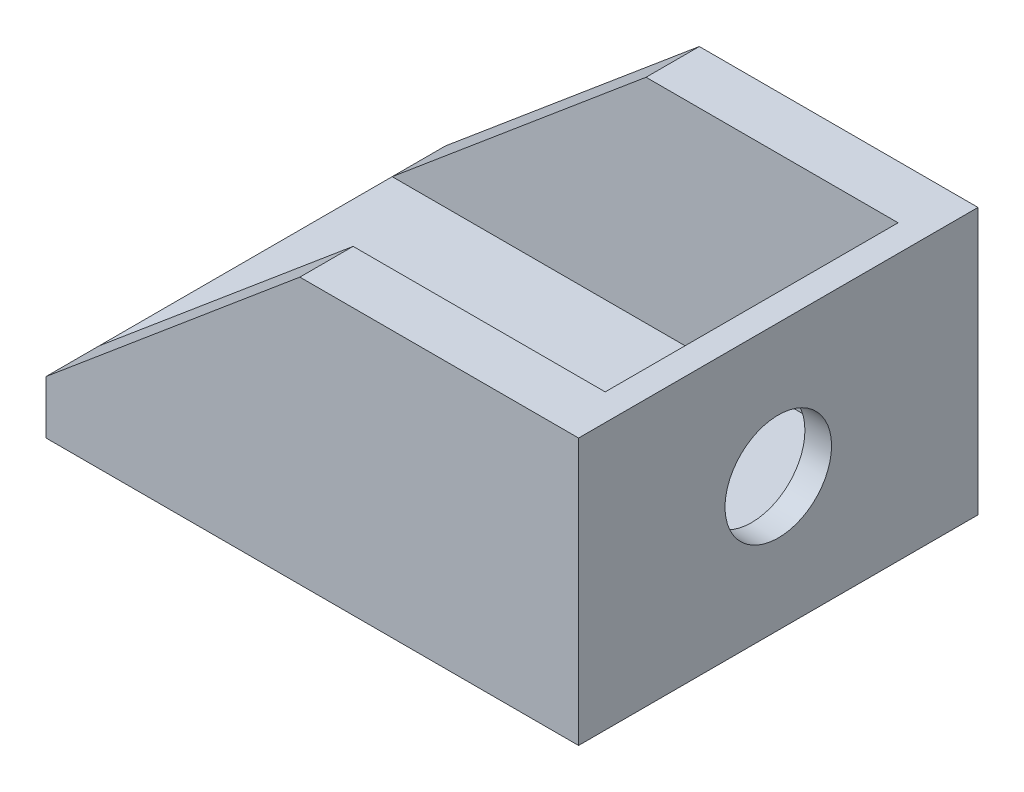
ISO-10303-21;
HEADER;
FILE_DESCRIPTION(('STEP AP214'),'2;1');
FILE_NAME('part.step','',(''),(''),'','','');
FILE_SCHEMA(('AUTOMOTIVE_DESIGN { 1 0 10303 214 1 1 1 1 }'));
ENDSEC;
DATA;
#1=APPLICATION_CONTEXT('core data for automotive mechanical design processes');
#2=APPLICATION_PROTOCOL_DEFINITION('international standard','automotive_design',2000,#1);
#3=PRODUCT_CONTEXT('',#1,'mechanical');
#4=PRODUCT('Part','Part','',(#3));
#5=PRODUCT_RELATED_PRODUCT_CATEGORY('part','',(#4));
#6=PRODUCT_DEFINITION_FORMATION('','',#4);
#7=PRODUCT_DEFINITION_CONTEXT('part definition',#1,'design');
#8=PRODUCT_DEFINITION('design','',#6,#7);
#9=PRODUCT_DEFINITION_SHAPE('','',#8);
#10=(LENGTH_UNIT() NAMED_UNIT(*) SI_UNIT(.MILLI.,.METRE.));
#11=(NAMED_UNIT(*) PLANE_ANGLE_UNIT() SI_UNIT($,.RADIAN.));
#12=(NAMED_UNIT(*) SI_UNIT($,.STERADIAN.) SOLID_ANGLE_UNIT());
#13=UNCERTAINTY_MEASURE_WITH_UNIT(LENGTH_MEASURE(1.E-05),#10,'distance_accuracy_value','');
#14=(GEOMETRIC_REPRESENTATION_CONTEXT(3) GLOBAL_UNCERTAINTY_ASSIGNED_CONTEXT((#13)) GLOBAL_UNIT_ASSIGNED_CONTEXT((#10,
#11,#12)) REPRESENTATION_CONTEXT('',''));
#15=CARTESIAN_POINT('',(0.,0.,0.));
#16=DIRECTION('',(0.,0.,1.));
#17=DIRECTION('',(1.,0.,0.));
#18=AXIS2_PLACEMENT_3D('',#15,#16,#17);
#19=CARTESIAN_POINT('',(0.,2.,0.));
#20=DIRECTION('',(1.,0.,0.));
#21=DIRECTION('',(0.,0.,-1.));
#22=AXIS2_PLACEMENT_3D('',#19,#20,#21);
#23=PLANE('',#22);
#24=DIRECTION('',(0.,0.,1.));
#25=VECTOR('',#24,1.);
#26=CARTESIAN_POINT('',(0.,2.,0.));
#27=LINE('',#26,#25);
#28=CARTESIAN_POINT('',(0.,2.,-11.));
#29=VERTEX_POINT('',#28);
#30=CARTESIAN_POINT('',(0.,2.,0.));
#31=VERTEX_POINT('',#30);
#32=EDGE_CURVE('E166',#29,#31,#27,.T.);
#33=ORIENTED_EDGE('',*,*,#32,.F.);
#34=CARTESIAN_POINT('',(0.,2.,-13.));
#35=VERTEX_POINT('',#34);
#36=EDGE_CURVE('E162',#35,#29,#27,.T.);
#37=ORIENTED_EDGE('',*,*,#36,.F.);
#38=DIRECTION('',(0.,-1.,0.));
#39=VECTOR('',#38,1.);
#40=CARTESIAN_POINT('',(0.,2.,-13.));
#41=LINE('',#40,#39);
#42=CARTESIAN_POINT('',(0.,0.,-13.));
#43=VERTEX_POINT('',#42);
#44=EDGE_CURVE('E43',#35,#43,#41,.T.);
#45=ORIENTED_EDGE('',*,*,#44,.T.);
#46=DIRECTION('',(0.,0.,1.));
#47=VECTOR('',#46,1.);
#48=CARTESIAN_POINT('',(0.,0.,0.));
#49=LINE('',#48,#47);
#50=CARTESIAN_POINT('',(0.,0.,2.));
#51=VERTEX_POINT('',#50);
#52=EDGE_CURVE('E161',#43,#51,#49,.T.);
#53=ORIENTED_EDGE('',*,*,#52,.T.);
#54=DIRECTION('',(0.,-1.,0.));
#55=VECTOR('',#54,1.);
#56=CARTESIAN_POINT('',(0.,0.,2.));
#57=LINE('',#56,#55);
#58=CARTESIAN_POINT('',(0.,2.,2.));
#59=VERTEX_POINT('',#58);
#60=EDGE_CURVE('E137',#59,#51,#57,.T.);
#61=ORIENTED_EDGE('',*,*,#60,.F.);
#62=DIRECTION('',(0.,0.,-1.));
#63=VECTOR('',#62,1.);
#64=CARTESIAN_POINT('',(0.,2.,2.));
#65=LINE('',#64,#63);
#66=EDGE_CURVE('E150',#59,#31,#65,.T.);
#67=ORIENTED_EDGE('',*,*,#66,.T.);
#68=EDGE_LOOP('',(#33,#37,#45,#53,#61,#67));
#69=FACE_BOUND('',#68,.T.);
#70=ADVANCED_FACE('F35',(#69),#23,.F.);
#71=CARTESIAN_POINT('',(20.,2.,0.));
#72=DIRECTION('',(-1.,0.,0.));
#73=DIRECTION('',(0.,0.,1.));
#74=AXIS2_PLACEMENT_3D('',#71,#72,#73);
#75=PLANE('',#74);
#76=CARTESIAN_POINT('',(20.,5.,-5.5));
#77=DIRECTION('',(1.,0.,0.));
#78=DIRECTION('',(0.,0.,-1.));
#79=AXIS2_PLACEMENT_3D('',#76,#77,#78);
#80=CIRCLE('',#79,2.);
#81=CARTESIAN_POINT('',(20.,5.,-7.5));
#82=VERTEX_POINT('',#81);
#83=EDGE_CURVE('E199',#82,#82,#80,.T.);
#84=ORIENTED_EDGE('',*,*,#83,.F.);
#85=EDGE_LOOP('',(#84));
#86=FACE_BOUND('',#85,.T.);
#87=DIRECTION('',(0.,-1.,0.));
#88=VECTOR('',#87,1.);
#89=CARTESIAN_POINT('',(20.,2.,-13.));
#90=LINE('',#89,#88);
#91=CARTESIAN_POINT('',(20.,10.,-13.));
#92=VERTEX_POINT('',#91);
#93=CARTESIAN_POINT('',(20.,0.,-13.));
#94=VERTEX_POINT('',#93);
#95=EDGE_CURVE('E11',#92,#94,#90,.T.);
#96=ORIENTED_EDGE('',*,*,#95,.F.);
#97=DIRECTION('',(0.,0.,-1.));
#98=VECTOR('',#97,1.);
#99=CARTESIAN_POINT('',(20.,10.,2.));
#100=LINE('',#99,#98);
#101=CARTESIAN_POINT('',(20.,10.,2.));
#102=VERTEX_POINT('',#101);
#103=EDGE_CURVE('E159',#102,#92,#100,.T.);
#104=ORIENTED_EDGE('',*,*,#103,.F.);
#105=DIRECTION('',(0.,1.,0.));
#106=VECTOR('',#105,1.);
#107=CARTESIAN_POINT('',(20.,0.,2.));
#108=LINE('',#107,#106);
#109=CARTESIAN_POINT('',(20.,0.,2.));
#110=VERTEX_POINT('',#109);
#111=EDGE_CURVE('E144',#110,#102,#108,.T.);
#112=ORIENTED_EDGE('',*,*,#111,.F.);
#113=DIRECTION('',(0.,0.,-1.));
#114=VECTOR('',#113,1.);
#115=CARTESIAN_POINT('',(20.,0.,0.));
#116=LINE('',#115,#114);
#117=EDGE_CURVE('E169',#110,#94,#116,.T.);
#118=ORIENTED_EDGE('',*,*,#117,.T.);
#119=EDGE_LOOP('',(#96,#104,#112,#118));
#120=FACE_BOUND('',#119,.T.);
#121=ADVANCED_FACE('F220',(#86,#120),#75,.F.);
#122=CARTESIAN_POINT('',(0.,2.,-13.));
#123=DIRECTION('',(0.,0.,1.));
#124=DIRECTION('',(1.,0.,0.));
#125=AXIS2_PLACEMENT_3D('',#122,#123,#124);
#126=PLANE('',#125);
#127=DIRECTION('',(-1.,0.,0.));
#128=VECTOR('',#127,1.);
#129=CARTESIAN_POINT('',(0.,0.,-13.));
#130=LINE('',#129,#128);
#131=EDGE_CURVE('E171',#94,#43,#130,.T.);
#132=ORIENTED_EDGE('',*,*,#131,.T.);
#133=ORIENTED_EDGE('',*,*,#44,.F.);
#134=DIRECTION('',(-0.766044443118977,-0.64278760968654,0.));
#135=VECTOR('',#134,1.);
#136=CARTESIAN_POINT('',(0.,2.,-13.));
#137=LINE('',#136,#135);
#138=CARTESIAN_POINT('',(9.53402874075366,10.,-13.));
#139=VERTEX_POINT('',#138);
#140=EDGE_CURVE('E115',#139,#35,#137,.T.);
#141=ORIENTED_EDGE('',*,*,#140,.F.);
#142=DIRECTION('',(-1.,0.,0.));
#143=VECTOR('',#142,1.);
#144=CARTESIAN_POINT('',(9.53402874075366,10.,-13.));
#145=LINE('',#144,#143);
#146=EDGE_CURVE('E133',#92,#139,#145,.T.);
#147=ORIENTED_EDGE('',*,*,#146,.F.);
#148=ORIENTED_EDGE('',*,*,#95,.T.);
#149=EDGE_LOOP('',(#132,#133,#141,#147,#148));
#150=FACE_BOUND('',#149,.T.);
#151=ADVANCED_FACE('F224',(#150),#126,.F.);
#152=CARTESIAN_POINT('',(0.,2.,0.));
#153=DIRECTION('',(0.,-1.,0.));
#154=DIRECTION('',(0.,0.,-1.));
#155=AXIS2_PLACEMENT_3D('',#152,#153,#154);
#156=PLANE('',#155);
#157=DIRECTION('',(1.,0.,0.));
#158=VECTOR('',#157,1.);
#159=CARTESIAN_POINT('',(0.,2.,0.));
#160=LINE('',#159,#158);
#161=CARTESIAN_POINT('',(19.,2.,0.));
#162=VERTEX_POINT('',#161);
#163=EDGE_CURVE('E165',#31,#162,#160,.T.);
#164=ORIENTED_EDGE('',*,*,#163,.T.);
#165=DIRECTION('',(0.,0.,-1.));
#166=VECTOR('',#165,1.);
#167=CARTESIAN_POINT('',(19.,2.,0.));
#168=LINE('',#167,#166);
#169=CARTESIAN_POINT('',(19.,2.,-11.));
#170=VERTEX_POINT('',#169);
#171=EDGE_CURVE('E125',#162,#170,#168,.T.);
#172=ORIENTED_EDGE('',*,*,#171,.T.);
#173=DIRECTION('',(-1.,0.,0.));
#174=VECTOR('',#173,1.);
#175=CARTESIAN_POINT('',(0.,2.,-11.));
#176=LINE('',#175,#174);
#177=EDGE_CURVE('E122',#170,#29,#176,.T.);
#178=ORIENTED_EDGE('',*,*,#177,.T.);
#179=ORIENTED_EDGE('',*,*,#32,.T.);
#180=EDGE_LOOP('',(#164,#172,#178,#179));
#181=FACE_BOUND('',#180,.T.);
#182=ADVANCED_FACE('F196',(#181),#156,.F.);
#183=CARTESIAN_POINT('',(0.,0.,0.));
#184=DIRECTION('',(0.,-1.,0.));
#185=DIRECTION('',(0.,0.,-1.));
#186=AXIS2_PLACEMENT_3D('',#183,#184,#185);
#187=PLANE('',#186);
#188=DIRECTION('',(1.,0.,0.));
#189=VECTOR('',#188,1.);
#190=CARTESIAN_POINT('',(0.,0.,2.));
#191=LINE('',#190,#189);
#192=EDGE_CURVE('E140',#51,#110,#191,.T.);
#193=ORIENTED_EDGE('',*,*,#192,.F.);
#194=ORIENTED_EDGE('',*,*,#52,.F.);
#195=ORIENTED_EDGE('',*,*,#131,.F.);
#196=ORIENTED_EDGE('',*,*,#117,.F.);
#197=EDGE_LOOP('',(#193,#194,#195,#196));
#198=FACE_BOUND('',#197,.T.);
#199=ADVANCED_FACE('F185',(#198),#187,.T.);
#200=CARTESIAN_POINT('',(0.,0.,0.));
#201=DIRECTION('',(0.,0.,-1.));
#202=DIRECTION('',(-1.,0.,0.));
#203=AXIS2_PLACEMENT_3D('',#200,#201,#202);
#204=PLANE('',#203);
#205=DIRECTION('',(0.,-1.,0.));
#206=VECTOR('',#205,1.);
#207=CARTESIAN_POINT('',(19.,2.,0.));
#208=LINE('',#207,#206);
#209=CARTESIAN_POINT('',(19.,10.,0.));
#210=VERTEX_POINT('',#209);
#211=EDGE_CURVE('E50',#210,#162,#208,.T.);
#212=ORIENTED_EDGE('',*,*,#211,.T.);
#213=ORIENTED_EDGE('',*,*,#163,.F.);
#214=DIRECTION('',(-0.766044443118977,-0.64278760968654,0.));
#215=VECTOR('',#214,1.);
#216=CARTESIAN_POINT('',(0.,2.,0.));
#217=LINE('',#216,#215);
#218=CARTESIAN_POINT('',(9.53402874075366,10.,0.));
#219=VERTEX_POINT('',#218);
#220=EDGE_CURVE('E141',#219,#31,#217,.T.);
#221=ORIENTED_EDGE('',*,*,#220,.F.);
#222=DIRECTION('',(-1.,0.,0.));
#223=VECTOR('',#222,1.);
#224=CARTESIAN_POINT('',(9.53402874075366,10.,0.));
#225=LINE('',#224,#223);
#226=EDGE_CURVE('E55',#210,#219,#225,.T.);
#227=ORIENTED_EDGE('',*,*,#226,.F.);
#228=EDGE_LOOP('',(#212,#213,#221,#227));
#229=FACE_BOUND('',#228,.T.);
#230=ADVANCED_FACE('F194',(#229),#204,.T.);
#231=CARTESIAN_POINT('',(9.53402874075366,10.,2.));
#232=DIRECTION('',(0.,-1.,0.));
#233=DIRECTION('',(0.,0.,-1.));
#234=AXIS2_PLACEMENT_3D('',#231,#232,#233);
#235=PLANE('',#234);
#236=ORIENTED_EDGE('',*,*,#103,.T.);
#237=ORIENTED_EDGE('',*,*,#146,.T.);
#238=DIRECTION('',(0.,0.,1.));
#239=VECTOR('',#238,1.);
#240=CARTESIAN_POINT('',(9.53402874075366,10.,-13.));
#241=LINE('',#240,#239);
#242=CARTESIAN_POINT('',(9.53402874075366,10.,-11.));
#243=VERTEX_POINT('',#242);
#244=EDGE_CURVE('E111',#139,#243,#241,.T.);
#245=ORIENTED_EDGE('',*,*,#244,.T.);
#246=DIRECTION('',(-1.,0.,0.));
#247=VECTOR('',#246,1.);
#248=CARTESIAN_POINT('',(9.53402874075366,10.,-11.));
#249=LINE('',#248,#247);
#250=CARTESIAN_POINT('',(19.,10.,-11.));
#251=VERTEX_POINT('',#250);
#252=EDGE_CURVE('E105',#251,#243,#249,.T.);
#253=ORIENTED_EDGE('',*,*,#252,.F.);
#254=DIRECTION('',(0.,0.,1.));
#255=VECTOR('',#254,1.);
#256=CARTESIAN_POINT('',(19.,10.,0.));
#257=LINE('',#256,#255);
#258=EDGE_CURVE('E109',#251,#210,#257,.T.);
#259=ORIENTED_EDGE('',*,*,#258,.T.);
#260=ORIENTED_EDGE('',*,*,#226,.T.);
#261=DIRECTION('',(0.,0.,-1.));
#262=VECTOR('',#261,1.);
#263=CARTESIAN_POINT('',(9.53402874075366,10.,2.));
#264=LINE('',#263,#262);
#265=CARTESIAN_POINT('',(9.53402874075366,10.,2.));
#266=VERTEX_POINT('',#265);
#267=EDGE_CURVE('E156',#266,#219,#264,.T.);
#268=ORIENTED_EDGE('',*,*,#267,.F.);
#269=DIRECTION('',(-1.,0.,0.));
#270=VECTOR('',#269,1.);
#271=CARTESIAN_POINT('',(9.53402874075366,10.,2.));
#272=LINE('',#271,#270);
#273=EDGE_CURVE('E146',#102,#266,#272,.T.);
#274=ORIENTED_EDGE('',*,*,#273,.F.);
#275=EDGE_LOOP('',(#236,#237,#245,#253,#259,#260,#268,#274));
#276=FACE_BOUND('',#275,.T.);
#277=ADVANCED_FACE('F107',(#276),#235,.F.);
#278=CARTESIAN_POINT('',(0.,2.,2.));
#279=DIRECTION('',(0.64278760968654,-0.766044443118977,0.));
#280=DIRECTION('',(0.766044443118977,0.64278760968654,0.));
#281=AXIS2_PLACEMENT_3D('',#278,#279,#280);
#282=PLANE('',#281);
#283=ORIENTED_EDGE('',*,*,#220,.T.);
#284=ORIENTED_EDGE('',*,*,#66,.F.);
#285=DIRECTION('',(-0.766044443118977,-0.64278760968654,0.));
#286=VECTOR('',#285,1.);
#287=CARTESIAN_POINT('',(0.,2.,2.));
#288=LINE('',#287,#286);
#289=EDGE_CURVE('E148',#266,#59,#288,.T.);
#290=ORIENTED_EDGE('',*,*,#289,.F.);
#291=ORIENTED_EDGE('',*,*,#267,.T.);
#292=EDGE_LOOP('',(#283,#284,#290,#291));
#293=FACE_BOUND('',#292,.T.);
#294=ADVANCED_FACE('F192',(#293),#282,.F.);
#295=CARTESIAN_POINT('',(0.,0.,2.));
#296=DIRECTION('',(0.,0.,-1.));
#297=DIRECTION('',(-1.,0.,0.));
#298=AXIS2_PLACEMENT_3D('',#295,#296,#297);
#299=PLANE('',#298);
#300=ORIENTED_EDGE('',*,*,#111,.T.);
#301=ORIENTED_EDGE('',*,*,#273,.T.);
#302=ORIENTED_EDGE('',*,*,#289,.T.);
#303=ORIENTED_EDGE('',*,*,#60,.T.);
#304=ORIENTED_EDGE('',*,*,#192,.T.);
#305=EDGE_LOOP('',(#300,#301,#302,#303,#304));
#306=FACE_BOUND('',#305,.T.);
#307=ADVANCED_FACE('F188',(#306),#299,.F.);
#308=CARTESIAN_POINT('',(0.,0.,-11.));
#309=DIRECTION('',(0.,0.,1.));
#310=DIRECTION('',(-1.,0.,0.));
#311=AXIS2_PLACEMENT_3D('',#308,#309,#310);
#312=PLANE('',#311);
#313=DIRECTION('',(0.,1.,0.));
#314=VECTOR('',#313,1.);
#315=CARTESIAN_POINT('',(19.,2.,-11.));
#316=LINE('',#315,#314);
#317=EDGE_CURVE('E120',#170,#251,#316,.T.);
#318=ORIENTED_EDGE('',*,*,#317,.T.);
#319=ORIENTED_EDGE('',*,*,#252,.T.);
#320=DIRECTION('',(-0.766044443118977,-0.64278760968654,0.));
#321=VECTOR('',#320,1.);
#322=CARTESIAN_POINT('',(0.,2.,-11.));
#323=LINE('',#322,#321);
#324=EDGE_CURVE('E116',#243,#29,#323,.T.);
#325=ORIENTED_EDGE('',*,*,#324,.T.);
#326=ORIENTED_EDGE('',*,*,#177,.F.);
#327=EDGE_LOOP('',(#318,#319,#325,#326));
#328=FACE_BOUND('',#327,.T.);
#329=ADVANCED_FACE('F121',(#328),#312,.T.);
#330=CARTESIAN_POINT('',(0.,2.,-13.));
#331=DIRECTION('',(-0.64278760968654,0.766044443118977,0.));
#332=DIRECTION('',(-0.766044443118977,-0.64278760968654,0.));
#333=AXIS2_PLACEMENT_3D('',#330,#331,#332);
#334=PLANE('',#333);
#335=ORIENTED_EDGE('',*,*,#324,.F.);
#336=ORIENTED_EDGE('',*,*,#244,.F.);
#337=ORIENTED_EDGE('',*,*,#140,.T.);
#338=ORIENTED_EDGE('',*,*,#36,.T.);
#339=EDGE_LOOP('',(#335,#336,#337,#338));
#340=FACE_BOUND('',#339,.T.);
#341=ADVANCED_FACE('F209',(#340),#334,.T.);
#342=CARTESIAN_POINT('',(19.,0.,0.));
#343=DIRECTION('',(-1.,0.,0.));
#344=DIRECTION('',(0.,0.,1.));
#345=AXIS2_PLACEMENT_3D('',#342,#343,#344);
#346=PLANE('',#345);
#347=CARTESIAN_POINT('',(19.,5.,-5.5));
#348=DIRECTION('',(-1.,0.,0.));
#349=DIRECTION('',(0.,0.,1.));
#350=AXIS2_PLACEMENT_3D('',#347,#348,#349);
#351=CIRCLE('',#350,2.);
#352=CARTESIAN_POINT('',(19.,5.,-3.5));
#353=VERTEX_POINT('',#352);
#354=EDGE_CURVE('E38',#353,#353,#351,.T.);
#355=ORIENTED_EDGE('',*,*,#354,.F.);
#356=EDGE_LOOP('',(#355));
#357=FACE_BOUND('',#356,.T.);
#358=ORIENTED_EDGE('',*,*,#211,.F.);
#359=ORIENTED_EDGE('',*,*,#258,.F.);
#360=ORIENTED_EDGE('',*,*,#317,.F.);
#361=ORIENTED_EDGE('',*,*,#171,.F.);
#362=EDGE_LOOP('',(#358,#359,#360,#361));
#363=FACE_BOUND('',#362,.T.);
#364=ADVANCED_FACE('F127',(#357,#363),#346,.T.);
#365=CARTESIAN_POINT('',(14.,5.,-5.5));
#366=DIRECTION('',(1.,0.,0.));
#367=DIRECTION('',(0.,0.,-1.));
#368=AXIS2_PLACEMENT_3D('',#365,#366,#367);
#369=CYLINDRICAL_SURFACE('',#368,2.);
#370=ORIENTED_EDGE('',*,*,#354,.T.);
#371=EDGE_LOOP('',(#370));
#372=FACE_BOUND('',#371,.T.);
#373=ORIENTED_EDGE('',*,*,#83,.T.);
#374=EDGE_LOOP('',(#373));
#375=FACE_BOUND('',#374,.T.);
#376=ADVANCED_FACE('F206',(#372,#375),#369,.F.);
#377=CLOSED_SHELL('',(#70,#121,#151,#182,#199,#230,#277,#294,#307,#329,#341,#364,#376));
#378=MANIFOLD_SOLID_BREP('B2',#377);
#379=ADVANCED_BREP_SHAPE_REPRESENTATION('',(#18,#378),#14);
#380=SHAPE_DEFINITION_REPRESENTATION(#9,#379);
ENDSEC;
END-ISO-10303-21;
